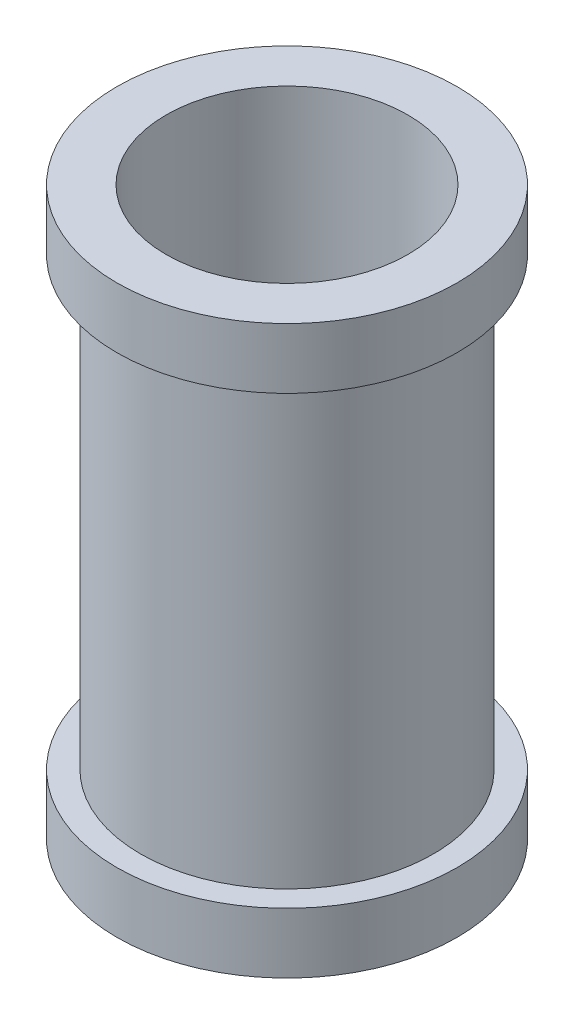
ISO-10303-21;
HEADER;
FILE_DESCRIPTION(('STEP AP214'),'2;1');
FILE_NAME('part.step','',(''),(''),'','','');
FILE_SCHEMA(('AUTOMOTIVE_DESIGN { 1 0 10303 214 1 1 1 1 }'));
ENDSEC;
DATA;
#1=APPLICATION_CONTEXT('core data for automotive mechanical design processes');
#2=APPLICATION_PROTOCOL_DEFINITION('international standard','automotive_design',2000,#1);
#3=PRODUCT_CONTEXT('',#1,'mechanical');
#4=PRODUCT('Part','Part','',(#3));
#5=PRODUCT_RELATED_PRODUCT_CATEGORY('part','',(#4));
#6=PRODUCT_DEFINITION_FORMATION('','',#4);
#7=PRODUCT_DEFINITION_CONTEXT('part definition',#1,'design');
#8=PRODUCT_DEFINITION('design','',#6,#7);
#9=PRODUCT_DEFINITION_SHAPE('','',#8);
#10=(LENGTH_UNIT() NAMED_UNIT(*) SI_UNIT(.MILLI.,.METRE.));
#11=(NAMED_UNIT(*) PLANE_ANGLE_UNIT() SI_UNIT($,.RADIAN.));
#12=(NAMED_UNIT(*) SI_UNIT($,.STERADIAN.) SOLID_ANGLE_UNIT());
#13=UNCERTAINTY_MEASURE_WITH_UNIT(LENGTH_MEASURE(1.E-05),#10,'distance_accuracy_value','');
#14=(GEOMETRIC_REPRESENTATION_CONTEXT(3) GLOBAL_UNCERTAINTY_ASSIGNED_CONTEXT((#13)) GLOBAL_UNIT_ASSIGNED_CONTEXT((#10,
#11,#12)) REPRESENTATION_CONTEXT('',''));
#15=CARTESIAN_POINT('',(0.,0.,0.));
#16=DIRECTION('',(0.,0.,1.));
#17=DIRECTION('',(1.,0.,0.));
#18=AXIS2_PLACEMENT_3D('',#15,#16,#17);
#19=CARTESIAN_POINT('',(-20.32,95.25,0.));
#20=DIRECTION('',(0.,1.,0.));
#21=DIRECTION('',(0.,0.,1.));
#22=AXIS2_PLACEMENT_3D('',#19,#20,#21);
#23=CYLINDRICAL_SURFACE('',#22,20.32);
#24=CARTESIAN_POINT('',(-20.32,0.,0.));
#25=DIRECTION('',(0.,1.,0.));
#26=DIRECTION('',(0.,0.,1.));
#27=AXIS2_PLACEMENT_3D('',#24,#25,#26);
#28=CIRCLE('',#27,20.32);
#29=CARTESIAN_POINT('',(-20.32,0.,20.32));
#30=VERTEX_POINT('',#29);
#31=EDGE_CURVE('E10',#30,#30,#28,.T.);
#32=ORIENTED_EDGE('',*,*,#31,.F.);
#33=EDGE_LOOP('',(#32));
#34=FACE_BOUND('',#33,.T.);
#35=CARTESIAN_POINT('',(-20.32,95.25,0.));
#36=DIRECTION('',(0.,1.,0.));
#37=DIRECTION('',(0.,0.,1.));
#38=AXIS2_PLACEMENT_3D('',#35,#36,#37);
#39=CIRCLE('',#38,20.32);
#40=CARTESIAN_POINT('',(-20.32,95.25,20.32));
#41=VERTEX_POINT('',#40);
#42=EDGE_CURVE('E72',#41,#41,#39,.T.);
#43=ORIENTED_EDGE('',*,*,#42,.T.);
#44=EDGE_LOOP('',(#43));
#45=FACE_BOUND('',#44,.T.);
#46=ADVANCED_FACE('F37',(#34,#45),#23,.F.);
#47=CARTESIAN_POINT('',(0.,0.,0.));
#48=DIRECTION('',(0.,1.,0.));
#49=DIRECTION('',(0.,0.,1.));
#50=AXIS2_PLACEMENT_3D('',#47,#48,#49);
#51=PLANE('',#50);
#52=CARTESIAN_POINT('',(-20.32,0.,0.));
#53=DIRECTION('',(0.,1.,0.));
#54=DIRECTION('',(0.,0.,1.));
#55=AXIS2_PLACEMENT_3D('',#52,#53,#54);
#56=CIRCLE('',#55,28.575);
#57=CARTESIAN_POINT('',(-20.32,0.,28.575));
#58=VERTEX_POINT('',#57);
#59=EDGE_CURVE('E44',#58,#58,#56,.T.);
#60=ORIENTED_EDGE('',*,*,#59,.F.);
#61=EDGE_LOOP('',(#60));
#62=FACE_BOUND('',#61,.T.);
#63=ORIENTED_EDGE('',*,*,#31,.T.);
#64=EDGE_LOOP('',(#63));
#65=FACE_BOUND('',#64,.T.);
#66=ADVANCED_FACE('F110',(#62,#65),#51,.F.);
#67=CARTESIAN_POINT('',(-20.32,95.25,0.));
#68=DIRECTION('',(0.,1.,0.));
#69=DIRECTION('',(0.,0.,1.));
#70=AXIS2_PLACEMENT_3D('',#67,#68,#69);
#71=CYLINDRICAL_SURFACE('',#70,28.575);
#72=CARTESIAN_POINT('',(-20.32,10.16,0.));
#73=DIRECTION('',(0.,1.,0.));
#74=DIRECTION('',(0.,0.,1.));
#75=AXIS2_PLACEMENT_3D('',#72,#73,#74);
#76=CIRCLE('',#75,28.575);
#77=CARTESIAN_POINT('',(-20.32,10.16,28.575));
#78=VERTEX_POINT('',#77);
#79=EDGE_CURVE('E49',#78,#78,#76,.T.);
#80=ORIENTED_EDGE('',*,*,#79,.F.);
#81=EDGE_LOOP('',(#80));
#82=FACE_BOUND('',#81,.T.);
#83=ORIENTED_EDGE('',*,*,#59,.T.);
#84=EDGE_LOOP('',(#83));
#85=FACE_BOUND('',#84,.T.);
#86=ADVANCED_FACE('F105',(#82,#85),#71,.T.);
#87=CARTESIAN_POINT('',(8.255,10.16,0.));
#88=DIRECTION('',(0.,-1.,0.));
#89=DIRECTION('',(0.,0.,-1.));
#90=AXIS2_PLACEMENT_3D('',#87,#88,#89);
#91=PLANE('',#90);
#92=CARTESIAN_POINT('',(-20.32,10.16,0.));
#93=DIRECTION('',(0.,1.,0.));
#94=DIRECTION('',(0.,0.,1.));
#95=AXIS2_PLACEMENT_3D('',#92,#93,#94);
#96=CIRCLE('',#95,24.60625);
#97=CARTESIAN_POINT('',(-20.32,10.16,24.60625));
#98=VERTEX_POINT('',#97);
#99=EDGE_CURVE('E54',#98,#98,#96,.T.);
#100=ORIENTED_EDGE('',*,*,#99,.F.);
#101=EDGE_LOOP('',(#100));
#102=FACE_BOUND('',#101,.T.);
#103=ORIENTED_EDGE('',*,*,#79,.T.);
#104=EDGE_LOOP('',(#103));
#105=FACE_BOUND('',#104,.T.);
#106=ADVANCED_FACE('F99',(#102,#105),#91,.F.);
#107=CARTESIAN_POINT('',(-20.32,95.25,0.));
#108=DIRECTION('',(0.,1.,0.));
#109=DIRECTION('',(0.,0.,1.));
#110=AXIS2_PLACEMENT_3D('',#107,#108,#109);
#111=CYLINDRICAL_SURFACE('',#110,24.60625);
#112=CARTESIAN_POINT('',(-20.32,85.09,0.));
#113=DIRECTION('',(0.,1.,0.));
#114=DIRECTION('',(0.,0.,1.));
#115=AXIS2_PLACEMENT_3D('',#112,#113,#114);
#116=CIRCLE('',#115,24.60625);
#117=CARTESIAN_POINT('',(-20.32,85.09,24.60625));
#118=VERTEX_POINT('',#117);
#119=EDGE_CURVE('E60',#118,#118,#116,.T.);
#120=ORIENTED_EDGE('',*,*,#119,.F.);
#121=EDGE_LOOP('',(#120));
#122=FACE_BOUND('',#121,.T.);
#123=ORIENTED_EDGE('',*,*,#99,.T.);
#124=EDGE_LOOP('',(#123));
#125=FACE_BOUND('',#124,.T.);
#126=ADVANCED_FACE('F93',(#122,#125),#111,.T.);
#127=CARTESIAN_POINT('',(8.25499999999999,85.09,0.));
#128=DIRECTION('',(0.,1.,0.));
#129=DIRECTION('',(0.,0.,1.));
#130=AXIS2_PLACEMENT_3D('',#127,#128,#129);
#131=PLANE('',#130);
#132=CARTESIAN_POINT('',(-20.32,85.09,0.));
#133=DIRECTION('',(0.,1.,0.));
#134=DIRECTION('',(0.,0.,1.));
#135=AXIS2_PLACEMENT_3D('',#132,#133,#134);
#136=CIRCLE('',#135,28.575);
#137=CARTESIAN_POINT('',(-20.32,85.09,28.575));
#138=VERTEX_POINT('',#137);
#139=EDGE_CURVE('E64',#138,#138,#136,.T.);
#140=ORIENTED_EDGE('',*,*,#139,.F.);
#141=EDGE_LOOP('',(#140));
#142=FACE_BOUND('',#141,.T.);
#143=ORIENTED_EDGE('',*,*,#119,.T.);
#144=EDGE_LOOP('',(#143));
#145=FACE_BOUND('',#144,.T.);
#146=ADVANCED_FACE('F87',(#142,#145),#131,.F.);
#147=CARTESIAN_POINT('',(-20.32,95.25,0.));
#148=DIRECTION('',(0.,1.,0.));
#149=DIRECTION('',(0.,0.,1.));
#150=AXIS2_PLACEMENT_3D('',#147,#148,#149);
#151=CYLINDRICAL_SURFACE('',#150,28.575);
#152=CARTESIAN_POINT('',(-20.32,95.25,0.));
#153=DIRECTION('',(0.,1.,0.));
#154=DIRECTION('',(0.,0.,1.));
#155=AXIS2_PLACEMENT_3D('',#152,#153,#154);
#156=CIRCLE('',#155,28.575);
#157=CARTESIAN_POINT('',(-20.32,95.25,28.575));
#158=VERTEX_POINT('',#157);
#159=EDGE_CURVE('E68',#158,#158,#156,.T.);
#160=ORIENTED_EDGE('',*,*,#159,.F.);
#161=EDGE_LOOP('',(#160));
#162=FACE_BOUND('',#161,.T.);
#163=ORIENTED_EDGE('',*,*,#139,.T.);
#164=EDGE_LOOP('',(#163));
#165=FACE_BOUND('',#164,.T.);
#166=ADVANCED_FACE('F81',(#162,#165),#151,.T.);
#167=CARTESIAN_POINT('',(8.25499999999999,95.25,0.));
#168=DIRECTION('',(0.,-1.,0.));
#169=DIRECTION('',(0.,0.,-1.));
#170=AXIS2_PLACEMENT_3D('',#167,#168,#169);
#171=PLANE('',#170);
#172=ORIENTED_EDGE('',*,*,#42,.F.);
#173=EDGE_LOOP('',(#172));
#174=FACE_BOUND('',#173,.T.);
#175=ORIENTED_EDGE('',*,*,#159,.T.);
#176=EDGE_LOOP('',(#175));
#177=FACE_BOUND('',#176,.T.);
#178=ADVANCED_FACE('F78',(#174,#177),#171,.F.);
#179=CLOSED_SHELL('',(#46,#66,#86,#106,#126,#146,#166,#178));
#180=MANIFOLD_SOLID_BREP('B2',#179);
#181=ADVANCED_BREP_SHAPE_REPRESENTATION('',(#18,#180),#14);
#182=SHAPE_DEFINITION_REPRESENTATION(#9,#181);
ENDSEC;
END-ISO-10303-21;
